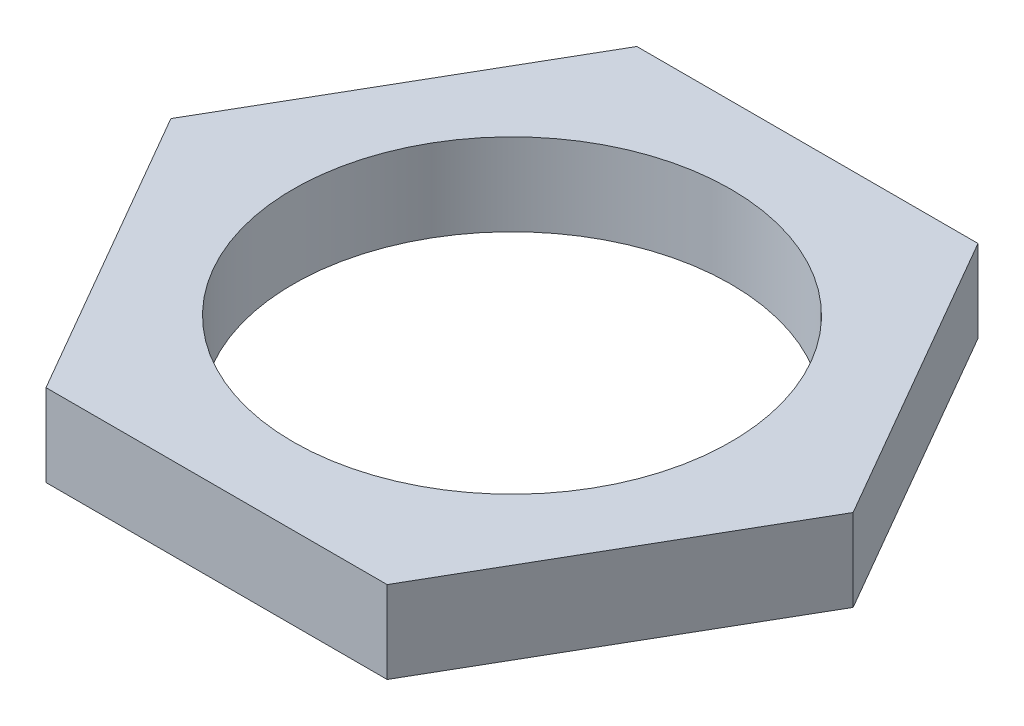
ISO-10303-21;
HEADER;
FILE_DESCRIPTION(('STEP AP214'),'2;1');
FILE_NAME('part.step','',(''),(''),'','','');
FILE_SCHEMA(('AUTOMOTIVE_DESIGN { 1 0 10303 214 1 1 1 1 }'));
ENDSEC;
DATA;
#1=APPLICATION_CONTEXT('core data for automotive mechanical design processes');
#2=APPLICATION_PROTOCOL_DEFINITION('international standard','automotive_design',2000,#1);
#3=PRODUCT_CONTEXT('',#1,'mechanical');
#4=PRODUCT('Part','Part','',(#3));
#5=PRODUCT_RELATED_PRODUCT_CATEGORY('part','',(#4));
#6=PRODUCT_DEFINITION_FORMATION('','',#4);
#7=PRODUCT_DEFINITION_CONTEXT('part definition',#1,'design');
#8=PRODUCT_DEFINITION('design','',#6,#7);
#9=PRODUCT_DEFINITION_SHAPE('','',#8);
#10=(LENGTH_UNIT() NAMED_UNIT(*) SI_UNIT(.MILLI.,.METRE.));
#11=(NAMED_UNIT(*) PLANE_ANGLE_UNIT() SI_UNIT($,.RADIAN.));
#12=(NAMED_UNIT(*) SI_UNIT($,.STERADIAN.) SOLID_ANGLE_UNIT());
#13=UNCERTAINTY_MEASURE_WITH_UNIT(LENGTH_MEASURE(1.E-05),#10,'distance_accuracy_value','');
#14=(GEOMETRIC_REPRESENTATION_CONTEXT(3) GLOBAL_UNCERTAINTY_ASSIGNED_CONTEXT((#13)) GLOBAL_UNIT_ASSIGNED_CONTEXT((#10,
#11,#12)) REPRESENTATION_CONTEXT('',''));
#15=CARTESIAN_POINT('',(0.,0.,0.));
#16=DIRECTION('',(0.,0.,1.));
#17=DIRECTION('',(1.,0.,0.));
#18=AXIS2_PLACEMENT_3D('',#15,#16,#17);
#19=CARTESIAN_POINT('',(6.6395280956807,20.4,11.5));
#20=DIRECTION('',(-0.866025403784439,0.,-0.5));
#21=DIRECTION('',(-0.5,0.,0.866025403784439));
#22=AXIS2_PLACEMENT_3D('',#19,#20,#21);
#23=PLANE('',#22);
#24=DIRECTION('',(0.5,0.,-0.866025403784439));
#25=VECTOR('',#24,1.);
#26=CARTESIAN_POINT('',(6.6395280956807,17.2,11.5));
#27=LINE('',#26,#25);
#28=CARTESIAN_POINT('',(6.6395280956807,17.2,11.5));
#29=VERTEX_POINT('',#28);
#30=CARTESIAN_POINT('',(13.2790561913614,17.2,0.));
#31=VERTEX_POINT('',#30);
#32=EDGE_CURVE('E127',#29,#31,#27,.T.);
#33=ORIENTED_EDGE('',*,*,#32,.T.);
#34=DIRECTION('',(0.,-1.,0.));
#35=VECTOR('',#34,1.);
#36=CARTESIAN_POINT('',(13.2790561913614,20.4,0.));
#37=LINE('',#36,#35);
#38=CARTESIAN_POINT('',(13.2790561913614,20.4,0.));
#39=VERTEX_POINT('',#38);
#40=EDGE_CURVE('E11',#39,#31,#37,.T.);
#41=ORIENTED_EDGE('',*,*,#40,.F.);
#42=DIRECTION('',(0.5,0.,-0.866025403784439));
#43=VECTOR('',#42,1.);
#44=CARTESIAN_POINT('',(6.6395280956807,20.4,11.5));
#45=LINE('',#44,#43);
#46=CARTESIAN_POINT('',(6.6395280956807,20.4,11.5));
#47=VERTEX_POINT('',#46);
#48=EDGE_CURVE('E139',#47,#39,#45,.T.);
#49=ORIENTED_EDGE('',*,*,#48,.F.);
#50=DIRECTION('',(0.,-1.,0.));
#51=VECTOR('',#50,1.);
#52=CARTESIAN_POINT('',(6.6395280956807,20.4,11.5));
#53=LINE('',#52,#51);
#54=EDGE_CURVE('E124',#47,#29,#53,.T.);
#55=ORIENTED_EDGE('',*,*,#54,.T.);
#56=EDGE_LOOP('',(#33,#41,#49,#55));
#57=FACE_BOUND('',#56,.T.);
#58=ADVANCED_FACE('F41',(#57),#23,.F.);
#59=CARTESIAN_POINT('',(13.2790561913614,20.4,0.));
#60=DIRECTION('',(-0.866025403784439,0.,0.5));
#61=DIRECTION('',(0.5,0.,0.866025403784439));
#62=AXIS2_PLACEMENT_3D('',#59,#60,#61);
#63=PLANE('',#62);
#64=DIRECTION('',(-0.5,0.,-0.866025403784439));
#65=VECTOR('',#64,1.);
#66=CARTESIAN_POINT('',(13.2790561913614,17.2,0.));
#67=LINE('',#66,#65);
#68=CARTESIAN_POINT('',(6.6395280956807,17.2,-11.5));
#69=VERTEX_POINT('',#68);
#70=EDGE_CURVE('E129',#31,#69,#67,.T.);
#71=ORIENTED_EDGE('',*,*,#70,.T.);
#72=DIRECTION('',(0.,-1.,0.));
#73=VECTOR('',#72,1.);
#74=CARTESIAN_POINT('',(6.6395280956807,20.4,-11.5));
#75=LINE('',#74,#73);
#76=CARTESIAN_POINT('',(6.6395280956807,20.4,-11.5));
#77=VERTEX_POINT('',#76);
#78=EDGE_CURVE('E49',#77,#69,#75,.T.);
#79=ORIENTED_EDGE('',*,*,#78,.F.);
#80=DIRECTION('',(-0.5,0.,-0.866025403784439));
#81=VECTOR('',#80,1.);
#82=CARTESIAN_POINT('',(13.2790561913614,20.4,0.));
#83=LINE('',#82,#81);
#84=EDGE_CURVE('E92',#39,#77,#83,.T.);
#85=ORIENTED_EDGE('',*,*,#84,.F.);
#86=ORIENTED_EDGE('',*,*,#40,.T.);
#87=EDGE_LOOP('',(#71,#79,#85,#86));
#88=FACE_BOUND('',#87,.T.);
#89=ADVANCED_FACE('F162',(#88),#63,.F.);
#90=CARTESIAN_POINT('',(6.6395280956807,20.4,-11.5));
#91=DIRECTION('',(0.,0.,1.));
#92=DIRECTION('',(1.,0.,0.));
#93=AXIS2_PLACEMENT_3D('',#90,#91,#92);
#94=PLANE('',#93);
#95=DIRECTION('',(-1.,0.,0.));
#96=VECTOR('',#95,1.);
#97=CARTESIAN_POINT('',(6.6395280956807,17.2,-11.5));
#98=LINE('',#97,#96);
#99=CARTESIAN_POINT('',(-6.63952809568069,17.2,-11.5));
#100=VERTEX_POINT('',#99);
#101=EDGE_CURVE('E131',#69,#100,#98,.T.);
#102=ORIENTED_EDGE('',*,*,#101,.T.);
#103=DIRECTION('',(0.,-1.,0.));
#104=VECTOR('',#103,1.);
#105=CARTESIAN_POINT('',(-6.63952809568069,20.4,-11.5));
#106=LINE('',#105,#104);
#107=CARTESIAN_POINT('',(-6.63952809568069,20.4,-11.5));
#108=VERTEX_POINT('',#107);
#109=EDGE_CURVE('E116',#108,#100,#106,.T.);
#110=ORIENTED_EDGE('',*,*,#109,.F.);
#111=DIRECTION('',(-1.,0.,0.));
#112=VECTOR('',#111,1.);
#113=CARTESIAN_POINT('',(6.6395280956807,20.4,-11.5));
#114=LINE('',#113,#112);
#115=EDGE_CURVE('E107',#77,#108,#114,.T.);
#116=ORIENTED_EDGE('',*,*,#115,.F.);
#117=ORIENTED_EDGE('',*,*,#78,.T.);
#118=EDGE_LOOP('',(#102,#110,#116,#117));
#119=FACE_BOUND('',#118,.T.);
#120=ADVANCED_FACE('F145',(#119),#94,.F.);
#121=CARTESIAN_POINT('',(-6.63952809568069,20.4,-11.5));
#122=DIRECTION('',(0.866025403784438,0.,0.5));
#123=DIRECTION('',(0.5,0.,-0.866025403784439));
#124=AXIS2_PLACEMENT_3D('',#121,#122,#123);
#125=PLANE('',#124);
#126=DIRECTION('',(-0.5,0.,0.866025403784438));
#127=VECTOR('',#126,1.);
#128=CARTESIAN_POINT('',(-6.63952809568069,17.2,-11.5));
#129=LINE('',#128,#127);
#130=CARTESIAN_POINT('',(-13.2790561913614,17.2,0.));
#131=VERTEX_POINT('',#130);
#132=EDGE_CURVE('E119',#100,#131,#129,.T.);
#133=ORIENTED_EDGE('',*,*,#132,.T.);
#134=DIRECTION('',(0.,-1.,0.));
#135=VECTOR('',#134,1.);
#136=CARTESIAN_POINT('',(-13.2790561913614,20.4,0.));
#137=LINE('',#136,#135);
#138=CARTESIAN_POINT('',(-13.2790561913614,20.4,0.));
#139=VERTEX_POINT('',#138);
#140=EDGE_CURVE('E114',#139,#131,#137,.T.);
#141=ORIENTED_EDGE('',*,*,#140,.F.);
#142=DIRECTION('',(-0.5,0.,0.866025403784438));
#143=VECTOR('',#142,1.);
#144=CARTESIAN_POINT('',(-6.63952809568069,20.4,-11.5));
#145=LINE('',#144,#143);
#146=EDGE_CURVE('E105',#108,#139,#145,.T.);
#147=ORIENTED_EDGE('',*,*,#146,.F.);
#148=ORIENTED_EDGE('',*,*,#109,.T.);
#149=EDGE_LOOP('',(#133,#141,#147,#148));
#150=FACE_BOUND('',#149,.T.);
#151=ADVANCED_FACE('F111',(#150),#125,.F.);
#152=CARTESIAN_POINT('',(-13.2790561913614,20.4,0.));
#153=DIRECTION('',(0.866025403784439,0.,-0.5));
#154=DIRECTION('',(-0.5,0.,-0.866025403784439));
#155=AXIS2_PLACEMENT_3D('',#152,#153,#154);
#156=PLANE('',#155);
#157=DIRECTION('',(0.5,0.,0.866025403784439));
#158=VECTOR('',#157,1.);
#159=CARTESIAN_POINT('',(-13.2790561913614,17.2,0.));
#160=LINE('',#159,#158);
#161=CARTESIAN_POINT('',(-6.6395280956807,17.2,11.5));
#162=VERTEX_POINT('',#161);
#163=EDGE_CURVE('E83',#131,#162,#160,.T.);
#164=ORIENTED_EDGE('',*,*,#163,.T.);
#165=DIRECTION('',(0.,-1.,0.));
#166=VECTOR('',#165,1.);
#167=CARTESIAN_POINT('',(-6.6395280956807,20.4,11.5));
#168=LINE('',#167,#166);
#169=CARTESIAN_POINT('',(-6.6395280956807,20.4,11.5));
#170=VERTEX_POINT('',#169);
#171=EDGE_CURVE('E120',#170,#162,#168,.T.);
#172=ORIENTED_EDGE('',*,*,#171,.F.);
#173=DIRECTION('',(0.5,0.,0.866025403784439));
#174=VECTOR('',#173,1.);
#175=CARTESIAN_POINT('',(-13.2790561913614,20.4,0.));
#176=LINE('',#175,#174);
#177=EDGE_CURVE('E106',#139,#170,#176,.T.);
#178=ORIENTED_EDGE('',*,*,#177,.F.);
#179=ORIENTED_EDGE('',*,*,#140,.T.);
#180=EDGE_LOOP('',(#164,#172,#178,#179));
#181=FACE_BOUND('',#180,.T.);
#182=ADVANCED_FACE('F117',(#181),#156,.F.);
#183=CARTESIAN_POINT('',(-6.6395280956807,20.4,11.5));
#184=DIRECTION('',(0.,0.,-1.));
#185=DIRECTION('',(-1.,0.,0.));
#186=AXIS2_PLACEMENT_3D('',#183,#184,#185);
#187=PLANE('',#186);
#188=DIRECTION('',(1.,0.,0.));
#189=VECTOR('',#188,1.);
#190=CARTESIAN_POINT('',(-6.6395280956807,17.2,11.5));
#191=LINE('',#190,#189);
#192=EDGE_CURVE('E87',#162,#29,#191,.T.);
#193=ORIENTED_EDGE('',*,*,#192,.T.);
#194=ORIENTED_EDGE('',*,*,#54,.F.);
#195=DIRECTION('',(1.,0.,0.));
#196=VECTOR('',#195,1.);
#197=CARTESIAN_POINT('',(-6.6395280956807,20.4,11.5));
#198=LINE('',#197,#196);
#199=EDGE_CURVE('E59',#170,#47,#198,.T.);
#200=ORIENTED_EDGE('',*,*,#199,.F.);
#201=ORIENTED_EDGE('',*,*,#171,.T.);
#202=EDGE_LOOP('',(#193,#194,#200,#201));
#203=FACE_BOUND('',#202,.T.);
#204=ADVANCED_FACE('F151',(#203),#187,.F.);
#205=CARTESIAN_POINT('',(0.,20.4,0.));
#206=DIRECTION('',(0.,1.,0.));
#207=DIRECTION('',(0.,0.,1.));
#208=AXIS2_PLACEMENT_3D('',#205,#206,#207);
#209=PLANE('',#208);
#210=CARTESIAN_POINT('',(0.,20.4,0.));
#211=DIRECTION('',(0.,1.,0.));
#212=DIRECTION('',(0.,0.,1.));
#213=AXIS2_PLACEMENT_3D('',#210,#211,#212);
#214=CIRCLE('',#213,8.52);
#215=CARTESIAN_POINT('',(0.,20.4,8.52));
#216=VERTEX_POINT('',#215);
#217=EDGE_CURVE('E128',#216,#216,#214,.T.);
#218=ORIENTED_EDGE('',*,*,#217,.F.);
#219=EDGE_LOOP('',(#218));
#220=FACE_BOUND('',#219,.T.);
#221=ORIENTED_EDGE('',*,*,#48,.T.);
#222=ORIENTED_EDGE('',*,*,#84,.T.);
#223=ORIENTED_EDGE('',*,*,#115,.T.);
#224=ORIENTED_EDGE('',*,*,#146,.T.);
#225=ORIENTED_EDGE('',*,*,#177,.T.);
#226=ORIENTED_EDGE('',*,*,#199,.T.);
#227=EDGE_LOOP('',(#221,#222,#223,#224,#225,#226));
#228=FACE_BOUND('',#227,.T.);
#229=ADVANCED_FACE('F102',(#220,#228),#209,.T.);
#230=CARTESIAN_POINT('',(0.,17.2,0.));
#231=DIRECTION('',(0.,1.,0.));
#232=DIRECTION('',(0.,0.,1.));
#233=AXIS2_PLACEMENT_3D('',#230,#231,#232);
#234=PLANE('',#233);
#235=CARTESIAN_POINT('',(0.,17.2,0.));
#236=DIRECTION('',(0.,1.,0.));
#237=DIRECTION('',(0.,0.,1.));
#238=AXIS2_PLACEMENT_3D('',#235,#236,#237);
#239=CIRCLE('',#238,8.52);
#240=CARTESIAN_POINT('',(0.,17.2,8.52));
#241=VERTEX_POINT('',#240);
#242=EDGE_CURVE('E42',#241,#241,#239,.T.);
#243=ORIENTED_EDGE('',*,*,#242,.T.);
#244=EDGE_LOOP('',(#243));
#245=FACE_BOUND('',#244,.T.);
#246=ORIENTED_EDGE('',*,*,#32,.F.);
#247=ORIENTED_EDGE('',*,*,#192,.F.);
#248=ORIENTED_EDGE('',*,*,#163,.F.);
#249=ORIENTED_EDGE('',*,*,#132,.F.);
#250=ORIENTED_EDGE('',*,*,#101,.F.);
#251=ORIENTED_EDGE('',*,*,#70,.F.);
#252=EDGE_LOOP('',(#246,#247,#248,#249,#250,#251));
#253=FACE_BOUND('',#252,.T.);
#254=ADVANCED_FACE('F150',(#245,#253),#234,.F.);
#255=CARTESIAN_POINT('',(0.,-100.,0.));
#256=DIRECTION('',(0.,-1.,0.));
#257=DIRECTION('',(0.,0.,-1.));
#258=AXIS2_PLACEMENT_3D('',#255,#256,#257);
#259=CYLINDRICAL_SURFACE('',#258,8.52);
#260=ORIENTED_EDGE('',*,*,#217,.T.);
#261=EDGE_LOOP('',(#260));
#262=FACE_BOUND('',#261,.T.);
#263=ORIENTED_EDGE('',*,*,#242,.F.);
#264=EDGE_LOOP('',(#263));
#265=FACE_BOUND('',#264,.T.);
#266=ADVANCED_FACE('F205',(#262,#265),#259,.F.);
#267=CLOSED_SHELL('',(#58,#89,#120,#151,#182,#204,#229,#254,#266));
#268=MANIFOLD_SOLID_BREP('B2',#267);
#269=ADVANCED_BREP_SHAPE_REPRESENTATION('',(#18,#268),#14);
#270=SHAPE_DEFINITION_REPRESENTATION(#9,#269);
ENDSEC;
END-ISO-10303-21;
